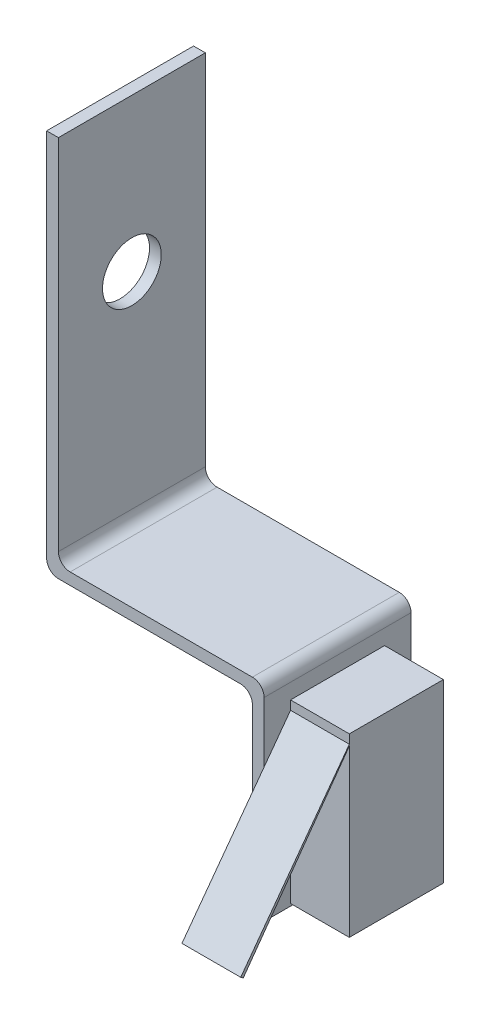
ISO-10303-21;
HEADER;
FILE_DESCRIPTION(('STEP AP214'),'2;1');
FILE_NAME('part.step','',(''),(''),'','','');
FILE_SCHEMA(('AUTOMOTIVE_DESIGN { 1 0 10303 214 1 1 1 1 }'));
ENDSEC;
DATA;
#1=APPLICATION_CONTEXT('core data for automotive mechanical design processes');
#2=APPLICATION_PROTOCOL_DEFINITION('international standard','automotive_design',2000,#1);
#3=PRODUCT_CONTEXT('',#1,'mechanical');
#4=PRODUCT('Part','Part','',(#3));
#5=PRODUCT_RELATED_PRODUCT_CATEGORY('part','',(#4));
#6=PRODUCT_DEFINITION_FORMATION('','',#4);
#7=PRODUCT_DEFINITION_CONTEXT('part definition',#1,'design');
#8=PRODUCT_DEFINITION('design','',#6,#7);
#9=PRODUCT_DEFINITION_SHAPE('','',#8);
#10=(LENGTH_UNIT() NAMED_UNIT(*) SI_UNIT(.MILLI.,.METRE.));
#11=(NAMED_UNIT(*) PLANE_ANGLE_UNIT() SI_UNIT($,.RADIAN.));
#12=(NAMED_UNIT(*) SI_UNIT($,.STERADIAN.) SOLID_ANGLE_UNIT());
#13=UNCERTAINTY_MEASURE_WITH_UNIT(LENGTH_MEASURE(1.E-05),#10,'distance_accuracy_value','');
#14=(GEOMETRIC_REPRESENTATION_CONTEXT(3) GLOBAL_UNCERTAINTY_ASSIGNED_CONTEXT((#13)) GLOBAL_UNIT_ASSIGNED_CONTEXT((#10,
#11,#12)) REPRESENTATION_CONTEXT('',''));
#15=CARTESIAN_POINT('',(0.,0.,0.));
#16=DIRECTION('',(0.,0.,1.));
#17=DIRECTION('',(1.,0.,0.));
#18=AXIS2_PLACEMENT_3D('',#15,#16,#17);
#19=CARTESIAN_POINT('',(47.,-67.6043528799355,8.));
#20=DIRECTION('',(0.,0.,-1.));
#21=DIRECTION('',(-1.,0.,0.));
#22=AXIS2_PLACEMENT_3D('',#19,#20,#21);
#23=PLANE('',#22);
#24=DIRECTION('',(0.,-1.,0.));
#25=VECTOR('',#24,1.);
#26=CARTESIAN_POINT('',(47.,-67.6043528799355,8.));
#27=LINE('',#26,#25);
#28=CARTESIAN_POINT('',(47.,-69.4103994427794,8.));
#29=VERTEX_POINT('',#28);
#30=CARTESIAN_POINT('',(47.,-97.6043528799355,8.));
#31=VERTEX_POINT('',#30);
#32=EDGE_CURVE('E219',#29,#31,#27,.T.);
#33=ORIENTED_EDGE('',*,*,#32,.F.);
#34=DIRECTION('',(1.,0.,0.));
#35=VECTOR('',#34,1.);
#36=CARTESIAN_POINT('',(37.,-69.4103994427794,8.));
#37=LINE('',#36,#35);
#38=CARTESIAN_POINT('',(37.,-69.4103994427794,8.));
#39=VERTEX_POINT('',#38);
#40=EDGE_CURVE('E606',#39,#29,#37,.T.);
#41=ORIENTED_EDGE('',*,*,#40,.F.);
#42=DIRECTION('',(0.,-1.,0.));
#43=VECTOR('',#42,1.);
#44=CARTESIAN_POINT('',(37.,-67.6043528799355,8.));
#45=LINE('',#44,#43);
#46=CARTESIAN_POINT('',(37.,-97.6043528799355,8.));
#47=VERTEX_POINT('',#46);
#48=EDGE_CURVE('E56',#39,#47,#45,.T.);
#49=ORIENTED_EDGE('',*,*,#48,.T.);
#50=DIRECTION('',(-1.,0.,0.));
#51=VECTOR('',#50,1.);
#52=CARTESIAN_POINT('',(47.,-97.6043528799355,8.));
#53=LINE('',#52,#51);
#54=EDGE_CURVE('E227',#31,#47,#53,.T.);
#55=ORIENTED_EDGE('',*,*,#54,.F.);
#56=EDGE_LOOP('',(#33,#41,#49,#55));
#57=FACE_BOUND('',#56,.T.);
#58=ADVANCED_FACE('F33',(#57),#23,.F.);
#59=CARTESIAN_POINT('',(37.,-63.,-12.5));
#60=DIRECTION('',(1.,0.,0.));
#61=DIRECTION('',(0.,0.,-1.));
#62=AXIS2_PLACEMENT_3D('',#59,#60,#61);
#63=PLANE('',#62);
#64=DIRECTION('',(0.,0.812461065203267,-0.583015452221271));
#65=VECTOR('',#64,1.);
#66=CARTESIAN_POINT('',(37.,-94.559298490791,26.0466454077713));
#67=LINE('',#66,#65);
#68=CARTESIAN_POINT('',(37.,-75.6813735301474,12.5));
#69=VERTEX_POINT('',#68);
#70=EDGE_CURVE('E621',#69,#39,#67,.T.);
#71=ORIENTED_EDGE('',*,*,#70,.F.);
#72=DIRECTION('',(0.,1.,0.));
#73=VECTOR('',#72,1.);
#74=CARTESIAN_POINT('',(37.,-63.,12.5));
#75=LINE('',#74,#73);
#76=CARTESIAN_POINT('',(37.,-98.,12.5));
#77=VERTEX_POINT('',#76);
#78=EDGE_CURVE('E247',#77,#69,#75,.T.);
#79=ORIENTED_EDGE('',*,*,#78,.F.);
#80=DIRECTION('',(0.,0.,1.));
#81=VECTOR('',#80,1.);
#82=CARTESIAN_POINT('',(37.,-98.,-12.5));
#83=LINE('',#82,#81);
#84=CARTESIAN_POINT('',(37.,-98.,-12.5));
#85=VERTEX_POINT('',#84);
#86=EDGE_CURVE('E287',#85,#77,#83,.T.);
#87=ORIENTED_EDGE('',*,*,#86,.F.);
#88=DIRECTION('',(0.,1.,0.));
#89=VECTOR('',#88,1.);
#90=CARTESIAN_POINT('',(37.,-63.,-12.5));
#91=LINE('',#90,#89);
#92=CARTESIAN_POINT('',(37.,-65.,-12.5));
#93=VERTEX_POINT('',#92);
#94=EDGE_CURVE('E269',#85,#93,#91,.T.);
#95=ORIENTED_EDGE('',*,*,#94,.T.);
#96=DIRECTION('',(0.,0.,1.));
#97=VECTOR('',#96,1.);
#98=CARTESIAN_POINT('',(37.,-65.,-12.5));
#99=LINE('',#98,#97);
#100=CARTESIAN_POINT('',(37.,-65.,12.5));
#101=VERTEX_POINT('',#100);
#102=EDGE_CURVE('E315',#93,#101,#99,.T.);
#103=ORIENTED_EDGE('',*,*,#102,.T.);
#104=CARTESIAN_POINT('',(37.,-75.2490321780362,12.5));
#105=VERTEX_POINT('',#104);
#106=EDGE_CURVE('E198',#105,#101,#75,.T.);
#107=ORIENTED_EDGE('',*,*,#106,.F.);
#108=DIRECTION('',(0.,-0.805363368840596,0.592781447187516));
#109=VECTOR('',#108,1.);
#110=CARTESIAN_POINT('',(37.,-69.1352525093614,8.));
#111=LINE('',#110,#109);
#112=CARTESIAN_POINT('',(37.,-69.1352525093614,8.));
#113=VERTEX_POINT('',#112);
#114=EDGE_CURVE('E181',#113,#105,#111,.T.);
#115=ORIENTED_EDGE('',*,*,#114,.F.);
#116=CARTESIAN_POINT('',(37.,-67.6043528799355,8.));
#117=VERTEX_POINT('',#116);
#118=EDGE_CURVE('E195',#117,#113,#45,.T.);
#119=ORIENTED_EDGE('',*,*,#118,.F.);
#120=DIRECTION('',(0.,0.,-1.));
#121=VECTOR('',#120,1.);
#122=CARTESIAN_POINT('',(37.,-67.6043528799355,8.));
#123=LINE('',#122,#121);
#124=CARTESIAN_POINT('',(37.,-67.6043528799355,-8.));
#125=VERTEX_POINT('',#124);
#126=EDGE_CURVE('E217',#117,#125,#123,.T.);
#127=ORIENTED_EDGE('',*,*,#126,.T.);
#128=DIRECTION('',(0.,-1.,0.));
#129=VECTOR('',#128,1.);
#130=CARTESIAN_POINT('',(37.,-67.6043528799355,-8.));
#131=LINE('',#130,#129);
#132=CARTESIAN_POINT('',(37.,-97.6043528799355,-8.));
#133=VERTEX_POINT('',#132);
#134=EDGE_CURVE('E209',#125,#133,#131,.T.);
#135=ORIENTED_EDGE('',*,*,#134,.T.);
#136=DIRECTION('',(0.,0.,-1.));
#137=VECTOR('',#136,1.);
#138=CARTESIAN_POINT('',(37.,-97.6043528799355,8.));
#139=LINE('',#138,#137);
#140=EDGE_CURVE('E206',#47,#133,#139,.T.);
#141=ORIENTED_EDGE('',*,*,#140,.F.);
#142=ORIENTED_EDGE('',*,*,#48,.F.);
#143=EDGE_LOOP('',(#71,#79,#87,#95,#103,#107,#115,#119,#127,#135,#141,#142));
#144=FACE_BOUND('',#143,.T.);
#145=ADVANCED_FACE('F194',(#144),#63,.T.);
#146=CARTESIAN_POINT('',(0.,-65.,-12.5));
#147=DIRECTION('',(-1.,0.,0.));
#148=DIRECTION('',(0.,0.,1.));
#149=AXIS2_PLACEMENT_3D('',#146,#147,#148);
#150=PLANE('',#149);
#151=CARTESIAN_POINT('',(0.,-26.,0.));
#152=DIRECTION('',(1.,0.,0.));
#153=DIRECTION('',(0.,0.,-1.));
#154=AXIS2_PLACEMENT_3D('',#151,#152,#153);
#155=CIRCLE('',#154,5.);
#156=CARTESIAN_POINT('',(0.,-26.,-5.));
#157=VERTEX_POINT('',#156);
#158=EDGE_CURVE('E233',#157,#157,#155,.T.);
#159=ORIENTED_EDGE('',*,*,#158,.T.);
#160=EDGE_LOOP('',(#159));
#161=FACE_BOUND('',#160,.T.);
#162=DIRECTION('',(0.,-1.,0.));
#163=VECTOR('',#162,1.);
#164=CARTESIAN_POINT('',(0.,-65.,-12.5));
#165=LINE('',#164,#163);
#166=CARTESIAN_POINT('',(0.,0.,-12.5));
#167=VERTEX_POINT('',#166);
#168=CARTESIAN_POINT('',(0.,-63.,-12.5));
#169=VERTEX_POINT('',#168);
#170=EDGE_CURVE('E258',#167,#169,#165,.T.);
#171=ORIENTED_EDGE('',*,*,#170,.T.);
#172=DIRECTION('',(0.,0.,1.));
#173=VECTOR('',#172,1.);
#174=CARTESIAN_POINT('',(0.,-63.,-12.5));
#175=LINE('',#174,#173);
#176=CARTESIAN_POINT('',(0.,-63.,12.5));
#177=VERTEX_POINT('',#176);
#178=EDGE_CURVE('E297',#169,#177,#175,.T.);
#179=ORIENTED_EDGE('',*,*,#178,.T.);
#180=DIRECTION('',(0.,-1.,0.));
#181=VECTOR('',#180,1.);
#182=CARTESIAN_POINT('',(0.,-65.,12.5));
#183=LINE('',#182,#181);
#184=CARTESIAN_POINT('',(0.,0.,12.5));
#185=VERTEX_POINT('',#184);
#186=EDGE_CURVE('E236',#185,#177,#183,.T.);
#187=ORIENTED_EDGE('',*,*,#186,.F.);
#188=DIRECTION('',(0.,0.,1.));
#189=VECTOR('',#188,1.);
#190=CARTESIAN_POINT('',(0.,0.,-12.5));
#191=LINE('',#190,#189);
#192=EDGE_CURVE('E281',#167,#185,#191,.T.);
#193=ORIENTED_EDGE('',*,*,#192,.F.);
#194=EDGE_LOOP('',(#171,#179,#187,#193));
#195=FACE_BOUND('',#194,.T.);
#196=ADVANCED_FACE('F372',(#161,#195),#150,.T.);
#197=CARTESIAN_POINT('',(0.,0.,-12.5));
#198=DIRECTION('',(0.,1.,0.));
#199=DIRECTION('',(0.,0.,1.));
#200=AXIS2_PLACEMENT_3D('',#197,#198,#199);
#201=PLANE('',#200);
#202=ORIENTED_EDGE('',*,*,#192,.T.);
#203=DIRECTION('',(-1.,0.,0.));
#204=VECTOR('',#203,1.);
#205=CARTESIAN_POINT('',(0.,0.,12.5));
#206=LINE('',#205,#204);
#207=CARTESIAN_POINT('',(2.,0.,12.5));
#208=VERTEX_POINT('',#207);
#209=EDGE_CURVE('E255',#208,#185,#206,.T.);
#210=ORIENTED_EDGE('',*,*,#209,.F.);
#211=DIRECTION('',(0.,0.,1.));
#212=VECTOR('',#211,1.);
#213=CARTESIAN_POINT('',(2.,0.,-12.5));
#214=LINE('',#213,#212);
#215=CARTESIAN_POINT('',(2.,0.,-12.5));
#216=VERTEX_POINT('',#215);
#217=EDGE_CURVE('E284',#216,#208,#214,.T.);
#218=ORIENTED_EDGE('',*,*,#217,.F.);
#219=DIRECTION('',(-1.,0.,0.));
#220=VECTOR('',#219,1.);
#221=CARTESIAN_POINT('',(0.,0.,-12.5));
#222=LINE('',#221,#220);
#223=EDGE_CURVE('E277',#216,#167,#222,.T.);
#224=ORIENTED_EDGE('',*,*,#223,.T.);
#225=EDGE_LOOP('',(#202,#210,#218,#224));
#226=FACE_BOUND('',#225,.T.);
#227=ADVANCED_FACE('F375',(#226),#201,.T.);
#228=CARTESIAN_POINT('',(2.,0.,-12.5));
#229=DIRECTION('',(1.,0.,0.));
#230=DIRECTION('',(0.,1.,0.));
#231=AXIS2_PLACEMENT_3D('',#228,#229,#230);
#232=PLANE('',#231);
#233=CARTESIAN_POINT('',(2.,-26.,0.));
#234=DIRECTION('',(1.,0.,0.));
#235=DIRECTION('',(0.,0.,-1.));
#236=AXIS2_PLACEMENT_3D('',#233,#234,#235);
#237=CIRCLE('',#236,5.);
#238=CARTESIAN_POINT('',(2.,-26.,-5.));
#239=VERTEX_POINT('',#238);
#240=EDGE_CURVE('E230',#239,#239,#237,.T.);
#241=ORIENTED_EDGE('',*,*,#240,.F.);
#242=EDGE_LOOP('',(#241));
#243=FACE_BOUND('',#242,.T.);
#244=DIRECTION('',(0.,1.,0.));
#245=VECTOR('',#244,1.);
#246=CARTESIAN_POINT('',(2.,0.,12.5));
#247=LINE('',#246,#245);
#248=CARTESIAN_POINT('',(2.00000000000001,-61.,12.5));
#249=VERTEX_POINT('',#248);
#250=EDGE_CURVE('E253',#249,#208,#247,.T.);
#251=ORIENTED_EDGE('',*,*,#250,.F.);
#252=DIRECTION('',(0.,0.,1.));
#253=VECTOR('',#252,1.);
#254=CARTESIAN_POINT('',(2.00000000000001,-61.,-12.5));
#255=LINE('',#254,#253);
#256=CARTESIAN_POINT('',(2.00000000000001,-61.,-12.5));
#257=VERTEX_POINT('',#256);
#258=EDGE_CURVE('E313',#249,#257,#255,.F.);
#259=ORIENTED_EDGE('',*,*,#258,.T.);
#260=DIRECTION('',(0.,1.,0.));
#261=VECTOR('',#260,1.);
#262=CARTESIAN_POINT('',(2.,0.,-12.5));
#263=LINE('',#262,#261);
#264=EDGE_CURVE('E275',#257,#216,#263,.T.);
#265=ORIENTED_EDGE('',*,*,#264,.T.);
#266=ORIENTED_EDGE('',*,*,#217,.T.);
#267=EDGE_LOOP('',(#251,#259,#265,#266));
#268=FACE_BOUND('',#267,.T.);
#269=ADVANCED_FACE('F328',(#243,#268),#232,.T.);
#270=CARTESIAN_POINT('',(2.00000000000001,-63.,-12.5));
#271=DIRECTION('',(0.,1.,0.));
#272=DIRECTION('',(0.,0.,1.));
#273=AXIS2_PLACEMENT_3D('',#270,#271,#272);
#274=PLANE('',#273);
#275=DIRECTION('',(-1.,0.,0.));
#276=VECTOR('',#275,1.);
#277=CARTESIAN_POINT('',(2.00000000000001,-63.,-12.5));
#278=LINE('',#277,#276);
#279=CARTESIAN_POINT('',(35.,-63.,-12.5));
#280=VERTEX_POINT('',#279);
#281=CARTESIAN_POINT('',(4.00000000000001,-63.,-12.5));
#282=VERTEX_POINT('',#281);
#283=EDGE_CURVE('E272',#280,#282,#278,.T.);
#284=ORIENTED_EDGE('',*,*,#283,.T.);
#285=DIRECTION('',(0.,0.,1.));
#286=VECTOR('',#285,1.);
#287=CARTESIAN_POINT('',(4.00000000000001,-63.,12.5));
#288=LINE('',#287,#286);
#289=CARTESIAN_POINT('',(4.00000000000001,-63.,12.5));
#290=VERTEX_POINT('',#289);
#291=EDGE_CURVE('E310',#282,#290,#288,.T.);
#292=ORIENTED_EDGE('',*,*,#291,.T.);
#293=DIRECTION('',(-1.,0.,0.));
#294=VECTOR('',#293,1.);
#295=CARTESIAN_POINT('',(2.00000000000001,-63.,12.5));
#296=LINE('',#295,#294);
#297=CARTESIAN_POINT('',(35.,-63.,12.5));
#298=VERTEX_POINT('',#297);
#299=EDGE_CURVE('E250',#298,#290,#296,.T.);
#300=ORIENTED_EDGE('',*,*,#299,.F.);
#301=DIRECTION('',(0.,0.,1.));
#302=VECTOR('',#301,1.);
#303=CARTESIAN_POINT('',(35.,-63.,-12.5));
#304=LINE('',#303,#302);
#305=EDGE_CURVE('E308',#298,#280,#304,.F.);
#306=ORIENTED_EDGE('',*,*,#305,.T.);
#307=EDGE_LOOP('',(#284,#292,#300,#306));
#308=FACE_BOUND('',#307,.T.);
#309=ADVANCED_FACE('F341',(#308),#274,.T.);
#310=CARTESIAN_POINT('',(37.,-98.,-12.5));
#311=DIRECTION('',(0.,-1.,0.));
#312=DIRECTION('',(1.,0.,0.));
#313=AXIS2_PLACEMENT_3D('',#310,#311,#312);
#314=PLANE('',#313);
#315=ORIENTED_EDGE('',*,*,#86,.T.);
#316=DIRECTION('',(1.,0.,0.));
#317=VECTOR('',#316,1.);
#318=CARTESIAN_POINT('',(37.,-98.,12.5));
#319=LINE('',#318,#317);
#320=CARTESIAN_POINT('',(35.,-98.,12.5));
#321=VERTEX_POINT('',#320);
#322=EDGE_CURVE('E244',#321,#77,#319,.T.);
#323=ORIENTED_EDGE('',*,*,#322,.F.);
#324=DIRECTION('',(0.,0.,1.));
#325=VECTOR('',#324,1.);
#326=CARTESIAN_POINT('',(35.,-98.,-12.5));
#327=LINE('',#326,#325);
#328=CARTESIAN_POINT('',(35.,-98.,-12.5));
#329=VERTEX_POINT('',#328);
#330=EDGE_CURVE('E280',#329,#321,#327,.T.);
#331=ORIENTED_EDGE('',*,*,#330,.F.);
#332=DIRECTION('',(1.,0.,0.));
#333=VECTOR('',#332,1.);
#334=CARTESIAN_POINT('',(37.,-98.,-12.5));
#335=LINE('',#334,#333);
#336=EDGE_CURVE('E266',#329,#85,#335,.T.);
#337=ORIENTED_EDGE('',*,*,#336,.T.);
#338=EDGE_LOOP('',(#315,#323,#331,#337));
#339=FACE_BOUND('',#338,.T.);
#340=ADVANCED_FACE('F351',(#339),#314,.T.);
#341=CARTESIAN_POINT('',(35.,-98.,-12.5));
#342=DIRECTION('',(-1.,0.,0.));
#343=DIRECTION('',(0.,0.,1.));
#344=AXIS2_PLACEMENT_3D('',#341,#342,#343);
#345=PLANE('',#344);
#346=DIRECTION('',(0.,-1.,0.));
#347=VECTOR('',#346,1.);
#348=CARTESIAN_POINT('',(35.,-98.,12.5));
#349=LINE('',#348,#347);
#350=CARTESIAN_POINT('',(35.,-67.,12.5));
#351=VERTEX_POINT('',#350);
#352=EDGE_CURVE('E242',#351,#321,#349,.T.);
#353=ORIENTED_EDGE('',*,*,#352,.F.);
#354=DIRECTION('',(0.,0.,1.));
#355=VECTOR('',#354,1.);
#356=CARTESIAN_POINT('',(35.,-67.,-12.5));
#357=LINE('',#356,#355);
#358=CARTESIAN_POINT('',(35.,-67.,-12.5));
#359=VERTEX_POINT('',#358);
#360=EDGE_CURVE('E295',#351,#359,#357,.F.);
#361=ORIENTED_EDGE('',*,*,#360,.T.);
#362=DIRECTION('',(0.,-1.,0.));
#363=VECTOR('',#362,1.);
#364=CARTESIAN_POINT('',(35.,-98.,-12.5));
#365=LINE('',#364,#363);
#366=EDGE_CURVE('E264',#359,#329,#365,.T.);
#367=ORIENTED_EDGE('',*,*,#366,.T.);
#368=ORIENTED_EDGE('',*,*,#330,.T.);
#369=EDGE_LOOP('',(#353,#361,#367,#368));
#370=FACE_BOUND('',#369,.T.);
#371=ADVANCED_FACE('F356',(#370),#345,.T.);
#372=CARTESIAN_POINT('',(35.,-65.,-12.5));
#373=DIRECTION('',(0.,-1.,0.));
#374=DIRECTION('',(0.,0.,-1.));
#375=AXIS2_PLACEMENT_3D('',#372,#373,#374);
#376=PLANE('',#375);
#377=DIRECTION('',(1.,0.,0.));
#378=VECTOR('',#377,1.);
#379=CARTESIAN_POINT('',(35.,-65.,-12.5));
#380=LINE('',#379,#378);
#381=CARTESIAN_POINT('',(2.,-65.,-12.5));
#382=VERTEX_POINT('',#381);
#383=CARTESIAN_POINT('',(33.,-65.,-12.5));
#384=VERTEX_POINT('',#383);
#385=EDGE_CURVE('E261',#382,#384,#380,.T.);
#386=ORIENTED_EDGE('',*,*,#385,.T.);
#387=DIRECTION('',(0.,0.,1.));
#388=VECTOR('',#387,1.);
#389=CARTESIAN_POINT('',(33.,-65.,12.5));
#390=LINE('',#389,#388);
#391=CARTESIAN_POINT('',(33.,-65.,12.5));
#392=VERTEX_POINT('',#391);
#393=EDGE_CURVE('E292',#384,#392,#390,.T.);
#394=ORIENTED_EDGE('',*,*,#393,.T.);
#395=DIRECTION('',(1.,0.,0.));
#396=VECTOR('',#395,1.);
#397=CARTESIAN_POINT('',(35.,-65.,12.5));
#398=LINE('',#397,#396);
#399=CARTESIAN_POINT('',(2.,-65.,12.5));
#400=VERTEX_POINT('',#399);
#401=EDGE_CURVE('E239',#400,#392,#398,.T.);
#402=ORIENTED_EDGE('',*,*,#401,.F.);
#403=DIRECTION('',(0.,0.,1.));
#404=VECTOR('',#403,1.);
#405=CARTESIAN_POINT('',(2.,-65.,-12.5));
#406=LINE('',#405,#404);
#407=EDGE_CURVE('E283',#400,#382,#406,.F.);
#408=ORIENTED_EDGE('',*,*,#407,.T.);
#409=EDGE_LOOP('',(#386,#394,#402,#408));
#410=FACE_BOUND('',#409,.T.);
#411=ADVANCED_FACE('F364',(#410),#376,.T.);
#412=CARTESIAN_POINT('',(0.,0.,-12.5));
#413=DIRECTION('',(0.,0.,-1.));
#414=DIRECTION('',(-1.,0.,0.));
#415=AXIS2_PLACEMENT_3D('',#412,#413,#414);
#416=PLANE('',#415);
#417=ORIENTED_EDGE('',*,*,#385,.F.);
#418=CARTESIAN_POINT('',(2.,-63.,-12.5));
#419=DIRECTION('',(0.,0.,-1.));
#420=DIRECTION('',(-1.,0.,0.));
#421=AXIS2_PLACEMENT_3D('',#418,#419,#420);
#422=CIRCLE('',#421,2.);
#423=EDGE_CURVE('E306',#382,#169,#422,.T.);
#424=ORIENTED_EDGE('',*,*,#423,.T.);
#425=ORIENTED_EDGE('',*,*,#170,.F.);
#426=ORIENTED_EDGE('',*,*,#223,.F.);
#427=ORIENTED_EDGE('',*,*,#264,.F.);
#428=CARTESIAN_POINT('',(4.00000000000001,-61.,-12.5));
#429=DIRECTION('',(0.,0.,-1.));
#430=DIRECTION('',(-1.,0.,0.));
#431=AXIS2_PLACEMENT_3D('',#428,#429,#430);
#432=CIRCLE('',#431,2.);
#433=EDGE_CURVE('E11',#257,#282,#432,.F.);
#434=ORIENTED_EDGE('',*,*,#433,.T.);
#435=ORIENTED_EDGE('',*,*,#283,.F.);
#436=CARTESIAN_POINT('',(35.,-65.,-12.5));
#437=DIRECTION('',(0.,0.,-1.));
#438=DIRECTION('',(-1.,0.,0.));
#439=AXIS2_PLACEMENT_3D('',#436,#437,#438);
#440=CIRCLE('',#439,2.);
#441=EDGE_CURVE('E304',#280,#93,#440,.T.);
#442=ORIENTED_EDGE('',*,*,#441,.T.);
#443=ORIENTED_EDGE('',*,*,#94,.F.);
#444=ORIENTED_EDGE('',*,*,#336,.F.);
#445=ORIENTED_EDGE('',*,*,#366,.F.);
#446=CARTESIAN_POINT('',(33.,-67.,-12.5));
#447=DIRECTION('',(0.,0.,-1.));
#448=DIRECTION('',(-1.,0.,0.));
#449=AXIS2_PLACEMENT_3D('',#446,#447,#448);
#450=CIRCLE('',#449,2.);
#451=EDGE_CURVE('E319',#359,#384,#450,.F.);
#452=ORIENTED_EDGE('',*,*,#451,.T.);
#453=EDGE_LOOP('',(#417,#424,#425,#426,#427,#434,#435,#442,#443,#444,#445,#452));
#454=FACE_BOUND('',#453,.T.);
#455=ADVANCED_FACE('F337',(#454),#416,.T.);
#456=CARTESIAN_POINT('',(0.,0.,12.5));
#457=DIRECTION('',(0.,0.,-1.));
#458=DIRECTION('',(-1.,0.,0.));
#459=AXIS2_PLACEMENT_3D('',#456,#457,#458);
#460=PLANE('',#459);
#461=ORIENTED_EDGE('',*,*,#186,.T.);
#462=CARTESIAN_POINT('',(2.,-63.,12.5));
#463=DIRECTION('',(0.,0.,-1.));
#464=DIRECTION('',(-1.,0.,0.));
#465=AXIS2_PLACEMENT_3D('',#462,#463,#464);
#466=CIRCLE('',#465,2.);
#467=EDGE_CURVE('E302',#177,#400,#466,.F.);
#468=ORIENTED_EDGE('',*,*,#467,.T.);
#469=ORIENTED_EDGE('',*,*,#401,.T.);
#470=CARTESIAN_POINT('',(33.,-67.,12.5));
#471=DIRECTION('',(0.,0.,-1.));
#472=DIRECTION('',(-1.,0.,0.));
#473=AXIS2_PLACEMENT_3D('',#470,#471,#472);
#474=CIRCLE('',#473,2.);
#475=EDGE_CURVE('E317',#392,#351,#474,.T.);
#476=ORIENTED_EDGE('',*,*,#475,.T.);
#477=ORIENTED_EDGE('',*,*,#352,.T.);
#478=ORIENTED_EDGE('',*,*,#322,.T.);
#479=ORIENTED_EDGE('',*,*,#78,.T.);
#480=DIRECTION('',(0.,1.,0.));
#481=VECTOR('',#480,1.);
#482=CARTESIAN_POINT('',(37.,0.,12.5));
#483=LINE('',#482,#481);
#484=EDGE_CURVE('E211',#69,#105,#483,.T.);
#485=ORIENTED_EDGE('',*,*,#484,.T.);
#486=ORIENTED_EDGE('',*,*,#106,.T.);
#487=CARTESIAN_POINT('',(35.,-65.,12.5));
#488=DIRECTION('',(0.,0.,-1.));
#489=DIRECTION('',(-1.,0.,0.));
#490=AXIS2_PLACEMENT_3D('',#487,#488,#489);
#491=CIRCLE('',#490,2.);
#492=EDGE_CURVE('E300',#101,#298,#491,.F.);
#493=ORIENTED_EDGE('',*,*,#492,.T.);
#494=ORIENTED_EDGE('',*,*,#299,.T.);
#495=CARTESIAN_POINT('',(4.00000000000001,-61.,12.5));
#496=DIRECTION('',(0.,0.,-1.));
#497=DIRECTION('',(-1.,0.,0.));
#498=AXIS2_PLACEMENT_3D('',#495,#496,#497);
#499=CIRCLE('',#498,2.);
#500=EDGE_CURVE('E41',#290,#249,#499,.T.);
#501=ORIENTED_EDGE('',*,*,#500,.T.);
#502=ORIENTED_EDGE('',*,*,#250,.T.);
#503=ORIENTED_EDGE('',*,*,#209,.T.);
#504=EDGE_LOOP('',(#461,#468,#469,#476,#477,#478,#479,#485,#486,#493,#494,#501,#502,#503));
#505=FACE_BOUND('',#504,.T.);
#506=ADVANCED_FACE('F322',(#505),#460,.F.);
#507=CARTESIAN_POINT('',(2.,-26.,0.));
#508=DIRECTION('',(1.,0.,0.));
#509=DIRECTION('',(0.,0.,-1.));
#510=AXIS2_PLACEMENT_3D('',#507,#508,#509);
#511=CYLINDRICAL_SURFACE('',#510,5.);
#512=ORIENTED_EDGE('',*,*,#158,.F.);
#513=EDGE_LOOP('',(#512));
#514=FACE_BOUND('',#513,.T.);
#515=ORIENTED_EDGE('',*,*,#240,.T.);
#516=EDGE_LOOP('',(#515));
#517=FACE_BOUND('',#516,.T.);
#518=ADVANCED_FACE('F413',(#514,#517),#511,.F.);
#519=CARTESIAN_POINT('',(33.,-67.,-12.5));
#520=DIRECTION('',(0.,0.,-1.));
#521=DIRECTION('',(-1.,0.,0.));
#522=AXIS2_PLACEMENT_3D('',#519,#520,#521);
#523=CYLINDRICAL_SURFACE('',#522,2.);
#524=ORIENTED_EDGE('',*,*,#451,.F.);
#525=ORIENTED_EDGE('',*,*,#360,.F.);
#526=ORIENTED_EDGE('',*,*,#475,.F.);
#527=ORIENTED_EDGE('',*,*,#393,.F.);
#528=EDGE_LOOP('',(#524,#525,#526,#527));
#529=FACE_BOUND('',#528,.T.);
#530=ADVANCED_FACE('F361',(#529),#523,.F.);
#531=CARTESIAN_POINT('',(2.,-63.,-12.5));
#532=DIRECTION('',(0.,0.,1.));
#533=DIRECTION('',(1.,0.,0.));
#534=AXIS2_PLACEMENT_3D('',#531,#532,#533);
#535=CYLINDRICAL_SURFACE('',#534,2.);
#536=ORIENTED_EDGE('',*,*,#423,.F.);
#537=ORIENTED_EDGE('',*,*,#407,.F.);
#538=ORIENTED_EDGE('',*,*,#467,.F.);
#539=ORIENTED_EDGE('',*,*,#178,.F.);
#540=EDGE_LOOP('',(#536,#537,#538,#539));
#541=FACE_BOUND('',#540,.T.);
#542=ADVANCED_FACE('F370',(#541),#535,.T.);
#543=CARTESIAN_POINT('',(4.00000000000001,-61.,-12.5));
#544=DIRECTION('',(0.,0.,-1.));
#545=DIRECTION('',(-1.,0.,0.));
#546=AXIS2_PLACEMENT_3D('',#543,#544,#545);
#547=CYLINDRICAL_SURFACE('',#546,2.);
#548=ORIENTED_EDGE('',*,*,#433,.F.);
#549=ORIENTED_EDGE('',*,*,#258,.F.);
#550=ORIENTED_EDGE('',*,*,#500,.F.);
#551=ORIENTED_EDGE('',*,*,#291,.F.);
#552=EDGE_LOOP('',(#548,#549,#550,#551));
#553=FACE_BOUND('',#552,.T.);
#554=ADVANCED_FACE('F333',(#553),#547,.F.);
#555=CARTESIAN_POINT('',(35.,-65.,-12.5));
#556=DIRECTION('',(0.,0.,1.));
#557=DIRECTION('',(1.,0.,0.));
#558=AXIS2_PLACEMENT_3D('',#555,#556,#557);
#559=CYLINDRICAL_SURFACE('',#558,2.);
#560=ORIENTED_EDGE('',*,*,#441,.F.);
#561=ORIENTED_EDGE('',*,*,#305,.F.);
#562=ORIENTED_EDGE('',*,*,#492,.F.);
#563=ORIENTED_EDGE('',*,*,#102,.F.);
#564=EDGE_LOOP('',(#560,#561,#562,#563));
#565=FACE_BOUND('',#564,.T.);
#566=ADVANCED_FACE('F35',(#565),#559,.T.);
#567=ORIENTED_EDGE('',*,*,#118,.T.);
#568=DIRECTION('',(1.,0.,0.));
#569=VECTOR('',#568,1.);
#570=CARTESIAN_POINT('',(37.,-69.1352525093614,8.));
#571=LINE('',#570,#569);
#572=CARTESIAN_POINT('',(47.,-69.1352525093614,8.));
#573=VERTEX_POINT('',#572);
#574=EDGE_CURVE('E178',#113,#573,#571,.T.);
#575=ORIENTED_EDGE('',*,*,#574,.T.);
#576=CARTESIAN_POINT('',(47.,-67.6043528799355,8.));
#577=VERTEX_POINT('',#576);
#578=EDGE_CURVE('E600',#577,#573,#27,.T.);
#579=ORIENTED_EDGE('',*,*,#578,.F.);
#580=DIRECTION('',(-1.,0.,0.));
#581=VECTOR('',#580,1.);
#582=CARTESIAN_POINT('',(47.,-67.6043528799355,8.));
#583=LINE('',#582,#581);
#584=EDGE_CURVE('E204',#577,#117,#583,.T.);
#585=ORIENTED_EDGE('',*,*,#584,.T.);
#586=EDGE_LOOP('',(#567,#575,#579,#585));
#587=FACE_BOUND('',#586,.T.);
#588=ADVANCED_FACE('F203',(#587),#23,.F.);
#589=CARTESIAN_POINT('',(47.,-97.6043528799355,8.));
#590=DIRECTION('',(0.,1.,0.));
#591=DIRECTION('',(0.,0.,1.));
#592=AXIS2_PLACEMENT_3D('',#589,#590,#591);
#593=PLANE('',#592);
#594=ORIENTED_EDGE('',*,*,#140,.T.);
#595=DIRECTION('',(-1.,0.,0.));
#596=VECTOR('',#595,1.);
#597=CARTESIAN_POINT('',(47.,-97.6043528799355,-8.));
#598=LINE('',#597,#596);
#599=CARTESIAN_POINT('',(47.,-97.6043528799355,-8.));
#600=VERTEX_POINT('',#599);
#601=EDGE_CURVE('E224',#600,#133,#598,.T.);
#602=ORIENTED_EDGE('',*,*,#601,.F.);
#603=DIRECTION('',(0.,0.,-1.));
#604=VECTOR('',#603,1.);
#605=CARTESIAN_POINT('',(47.,-97.6043528799355,8.));
#606=LINE('',#605,#604);
#607=EDGE_CURVE('E612',#31,#600,#606,.T.);
#608=ORIENTED_EDGE('',*,*,#607,.F.);
#609=ORIENTED_EDGE('',*,*,#54,.T.);
#610=EDGE_LOOP('',(#594,#602,#608,#609));
#611=FACE_BOUND('',#610,.T.);
#612=ADVANCED_FACE('F397',(#611),#593,.F.);
#613=CARTESIAN_POINT('',(47.,-67.6043528799355,-8.));
#614=DIRECTION('',(0.,0.,-1.));
#615=DIRECTION('',(0.,1.,0.));
#616=AXIS2_PLACEMENT_3D('',#613,#614,#615);
#617=PLANE('',#616);
#618=ORIENTED_EDGE('',*,*,#134,.F.);
#619=DIRECTION('',(-1.,0.,0.));
#620=VECTOR('',#619,1.);
#621=CARTESIAN_POINT('',(47.,-67.6043528799355,-8.));
#622=LINE('',#621,#620);
#623=CARTESIAN_POINT('',(47.,-67.6043528799355,-8.));
#624=VERTEX_POINT('',#623);
#625=EDGE_CURVE('E221',#624,#125,#622,.T.);
#626=ORIENTED_EDGE('',*,*,#625,.F.);
#627=DIRECTION('',(0.,-1.,0.));
#628=VECTOR('',#627,1.);
#629=CARTESIAN_POINT('',(47.,-67.6043528799355,-8.));
#630=LINE('',#629,#628);
#631=EDGE_CURVE('E613',#624,#600,#630,.T.);
#632=ORIENTED_EDGE('',*,*,#631,.T.);
#633=ORIENTED_EDGE('',*,*,#601,.T.);
#634=EDGE_LOOP('',(#618,#626,#632,#633));
#635=FACE_BOUND('',#634,.T.);
#636=ADVANCED_FACE('F402',(#635),#617,.T.);
#637=CARTESIAN_POINT('',(47.,-67.6043528799355,8.));
#638=DIRECTION('',(0.,1.,0.));
#639=DIRECTION('',(0.,0.,1.));
#640=AXIS2_PLACEMENT_3D('',#637,#638,#639);
#641=PLANE('',#640);
#642=ORIENTED_EDGE('',*,*,#126,.F.);
#643=ORIENTED_EDGE('',*,*,#584,.F.);
#644=DIRECTION('',(0.,0.,-1.));
#645=VECTOR('',#644,1.);
#646=CARTESIAN_POINT('',(47.,-67.6043528799355,8.));
#647=LINE('',#646,#645);
#648=EDGE_CURVE('E213',#577,#624,#647,.T.);
#649=ORIENTED_EDGE('',*,*,#648,.T.);
#650=ORIENTED_EDGE('',*,*,#625,.T.);
#651=EDGE_LOOP('',(#642,#643,#649,#650));
#652=FACE_BOUND('',#651,.T.);
#653=ADVANCED_FACE('F490',(#652),#641,.T.);
#654=CARTESIAN_POINT('',(47.,0.,0.));
#655=DIRECTION('',(1.,0.,0.));
#656=DIRECTION('',(0.,0.,-1.));
#657=AXIS2_PLACEMENT_3D('',#654,#655,#656);
#658=PLANE('',#657);
#659=ORIENTED_EDGE('',*,*,#578,.T.);
#660=DIRECTION('',(0.,-0.805363368840596,0.592781447187516));
#661=VECTOR('',#660,1.);
#662=CARTESIAN_POINT('',(47.,-69.1352525093614,8.));
#663=LINE('',#662,#661);
#664=CARTESIAN_POINT('',(47.,-94.2425666684797,26.4800434165011));
#665=VERTEX_POINT('',#664);
#666=EDGE_CURVE('E184',#573,#665,#663,.T.);
#667=ORIENTED_EDGE('',*,*,#666,.T.);
#668=DIRECTION('',(0.,-0.590038317946311,-0.807375243214138));
#669=VECTOR('',#668,1.);
#670=CARTESIAN_POINT('',(47.,-94.2425666684797,26.4800434165011));
#671=LINE('',#670,#669);
#672=CARTESIAN_POINT('',(47.,-94.559298490791,26.0466454077713));
#673=VERTEX_POINT('',#672);
#674=EDGE_CURVE('E594',#665,#673,#671,.T.);
#675=ORIENTED_EDGE('',*,*,#674,.T.);
#676=DIRECTION('',(0.,0.812461065203267,-0.583015452221271));
#677=VECTOR('',#676,1.);
#678=CARTESIAN_POINT('',(47.,-94.559298490791,26.0466454077713));
#679=LINE('',#678,#677);
#680=EDGE_CURVE('E48',#673,#29,#679,.T.);
#681=ORIENTED_EDGE('',*,*,#680,.T.);
#682=ORIENTED_EDGE('',*,*,#32,.T.);
#683=ORIENTED_EDGE('',*,*,#607,.T.);
#684=ORIENTED_EDGE('',*,*,#631,.F.);
#685=ORIENTED_EDGE('',*,*,#648,.F.);
#686=EDGE_LOOP('',(#659,#667,#675,#681,#682,#683,#684,#685));
#687=FACE_BOUND('',#686,.T.);
#688=ADVANCED_FACE('F499',(#687),#658,.T.);
#689=CARTESIAN_POINT('',(37.,0.,0.));
#690=DIRECTION('',(-1.,0.,0.));
#691=DIRECTION('',(0.,0.,1.));
#692=AXIS2_PLACEMENT_3D('',#689,#690,#691);
#693=PLANE('',#692);
#694=ORIENTED_EDGE('',*,*,#484,.F.);
#695=CARTESIAN_POINT('',(37.,-94.559298490791,26.0466454077713));
#696=VERTEX_POINT('',#695);
#697=EDGE_CURVE('E190',#696,#69,#67,.T.);
#698=ORIENTED_EDGE('',*,*,#697,.F.);
#699=DIRECTION('',(0.,-0.590038317946311,-0.807375243214138));
#700=VECTOR('',#699,1.);
#701=CARTESIAN_POINT('',(37.,-94.2425666684797,26.4800434165011));
#702=LINE('',#701,#700);
#703=CARTESIAN_POINT('',(37.,-94.2425666684797,26.4800434165011));
#704=VERTEX_POINT('',#703);
#705=EDGE_CURVE('E200',#704,#696,#702,.T.);
#706=ORIENTED_EDGE('',*,*,#705,.F.);
#707=EDGE_CURVE('E201',#105,#704,#111,.T.);
#708=ORIENTED_EDGE('',*,*,#707,.F.);
#709=EDGE_LOOP('',(#694,#698,#706,#708));
#710=FACE_BOUND('',#709,.T.);
#711=ADVANCED_FACE('F551',(#710),#693,.T.);
#712=CARTESIAN_POINT('',(37.,-94.559298490791,26.0466454077713));
#713=DIRECTION('',(0.,-0.583015452221271,-0.812461065203267));
#714=DIRECTION('',(0.,0.812461065203267,-0.583015452221271));
#715=AXIS2_PLACEMENT_3D('',#712,#713,#714);
#716=PLANE('',#715);
#717=ORIENTED_EDGE('',*,*,#680,.F.);
#718=DIRECTION('',(1.,0.,0.));
#719=VECTOR('',#718,1.);
#720=CARTESIAN_POINT('',(37.,-94.559298490791,26.0466454077713));
#721=LINE('',#720,#719);
#722=EDGE_CURVE('E597',#696,#673,#721,.T.);
#723=ORIENTED_EDGE('',*,*,#722,.F.);
#724=ORIENTED_EDGE('',*,*,#697,.T.);
#725=ORIENTED_EDGE('',*,*,#70,.T.);
#726=ORIENTED_EDGE('',*,*,#40,.T.);
#727=EDGE_LOOP('',(#717,#723,#724,#725,#726));
#728=FACE_BOUND('',#727,.T.);
#729=ADVANCED_FACE('F560',(#728),#716,.T.);
#730=CARTESIAN_POINT('',(37.,-94.2425666684797,26.4800434165011));
#731=DIRECTION('',(0.,-0.807375243214138,0.590038317946311));
#732=DIRECTION('',(0.,-0.590038317946311,-0.807375243214138));
#733=AXIS2_PLACEMENT_3D('',#730,#731,#732);
#734=PLANE('',#733);
#735=ORIENTED_EDGE('',*,*,#674,.F.);
#736=DIRECTION('',(1.,0.,0.));
#737=VECTOR('',#736,1.);
#738=CARTESIAN_POINT('',(37.,-94.2425666684797,26.4800434165011));
#739=LINE('',#738,#737);
#740=EDGE_CURVE('E189',#704,#665,#739,.T.);
#741=ORIENTED_EDGE('',*,*,#740,.F.);
#742=ORIENTED_EDGE('',*,*,#705,.T.);
#743=ORIENTED_EDGE('',*,*,#722,.T.);
#744=EDGE_LOOP('',(#735,#741,#742,#743));
#745=FACE_BOUND('',#744,.T.);
#746=ADVANCED_FACE('F570',(#745),#734,.T.);
#747=CARTESIAN_POINT('',(37.,-69.1352525093614,8.));
#748=DIRECTION('',(0.,0.592781447187516,0.805363368840596));
#749=DIRECTION('',(0.,-0.805363368840596,0.592781447187516));
#750=AXIS2_PLACEMENT_3D('',#747,#748,#749);
#751=PLANE('',#750);
#752=ORIENTED_EDGE('',*,*,#666,.F.);
#753=ORIENTED_EDGE('',*,*,#574,.F.);
#754=ORIENTED_EDGE('',*,*,#114,.T.);
#755=ORIENTED_EDGE('',*,*,#707,.T.);
#756=ORIENTED_EDGE('',*,*,#740,.T.);
#757=EDGE_LOOP('',(#752,#753,#754,#755,#756));
#758=FACE_BOUND('',#757,.T.);
#759=ADVANCED_FACE('F180',(#758),#751,.T.);
#760=CLOSED_SHELL('',(#58,#145,#196,#227,#269,#309,#340,#371,#411,#455,#506,#518,#530,#542,#554,
#566,#588,#612,#636,#653,#688,#711,#729,#746,#759));
#761=MANIFOLD_SOLID_BREP('B2',#760);
#762=ADVANCED_BREP_SHAPE_REPRESENTATION('',(#18,#761),#14);
#763=SHAPE_DEFINITION_REPRESENTATION(#9,#762);
ENDSEC;
END-ISO-10303-21;
